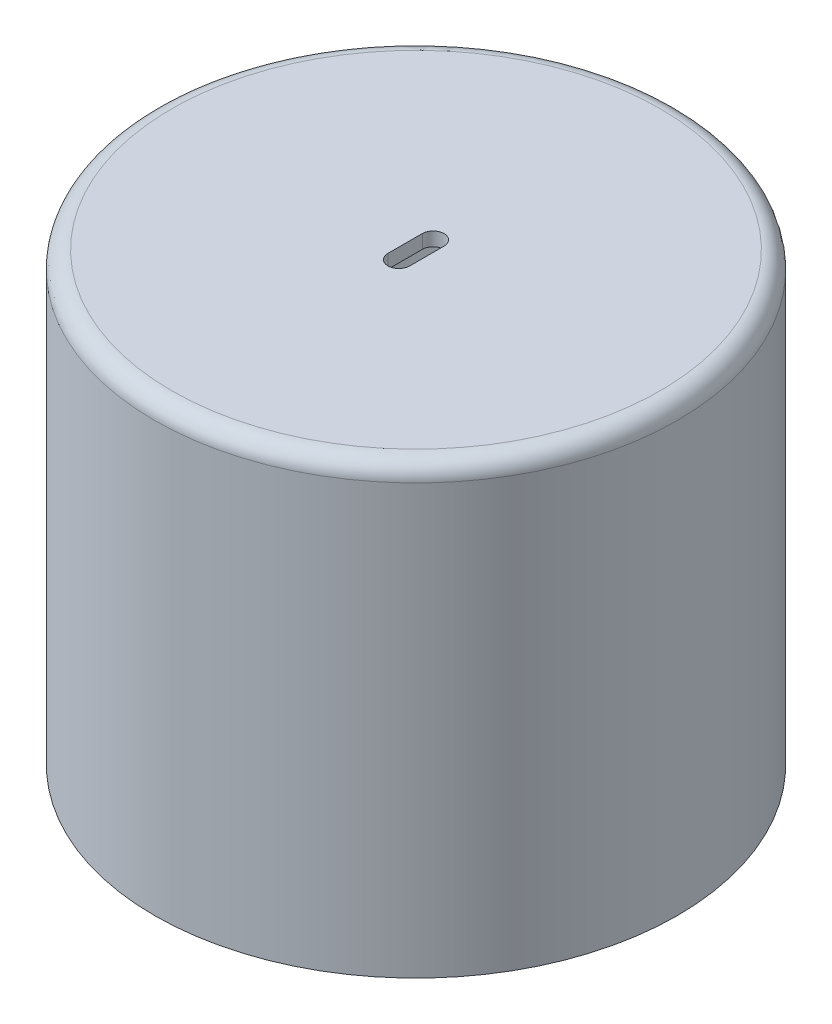
ISO-10303-21;
HEADER;
FILE_DESCRIPTION(('STEP AP214'),'2;1');
FILE_NAME('part.step','',(''),(''),'','','');
FILE_SCHEMA(('AUTOMOTIVE_DESIGN { 1 0 10303 214 1 1 1 1 }'));
ENDSEC;
DATA;
#1=APPLICATION_CONTEXT('core data for automotive mechanical design processes');
#2=APPLICATION_PROTOCOL_DEFINITION('international standard','automotive_design',2000,#1);
#3=PRODUCT_CONTEXT('',#1,'mechanical');
#4=PRODUCT('Part','Part','',(#3));
#5=PRODUCT_RELATED_PRODUCT_CATEGORY('part','',(#4));
#6=PRODUCT_DEFINITION_FORMATION('','',#4);
#7=PRODUCT_DEFINITION_CONTEXT('part definition',#1,'design');
#8=PRODUCT_DEFINITION('design','',#6,#7);
#9=PRODUCT_DEFINITION_SHAPE('','',#8);
#10=(LENGTH_UNIT() NAMED_UNIT(*) SI_UNIT(.MILLI.,.METRE.));
#11=(NAMED_UNIT(*) PLANE_ANGLE_UNIT() SI_UNIT($,.RADIAN.));
#12=(NAMED_UNIT(*) SI_UNIT($,.STERADIAN.) SOLID_ANGLE_UNIT());
#13=UNCERTAINTY_MEASURE_WITH_UNIT(LENGTH_MEASURE(1.E-05),#10,'distance_accuracy_value','');
#14=(GEOMETRIC_REPRESENTATION_CONTEXT(3) GLOBAL_UNCERTAINTY_ASSIGNED_CONTEXT((#13)) GLOBAL_UNIT_ASSIGNED_CONTEXT((#10,
#11,#12)) REPRESENTATION_CONTEXT('',''));
#15=CARTESIAN_POINT('',(0.,0.,0.));
#16=DIRECTION('',(0.,0.,1.));
#17=DIRECTION('',(1.,0.,0.));
#18=AXIS2_PLACEMENT_3D('',#15,#16,#17);
#19=CARTESIAN_POINT('',(0.,130.,0.));
#20=DIRECTION('',(0.,1.,0.));
#21=DIRECTION('',(0.,0.,1.));
#22=AXIS2_PLACEMENT_3D('',#19,#20,#21);
#23=PLANE('',#22);
#24=CARTESIAN_POINT('',(0.,130.,0.));
#25=DIRECTION('',(0.,1.,0.));
#26=DIRECTION('',(0.,0.,1.));
#27=AXIS2_PLACEMENT_3D('',#24,#25,#26);
#28=CIRCLE('',#27,71.2);
#29=CARTESIAN_POINT('',(0.,130.,71.2));
#30=VERTEX_POINT('',#29);
#31=EDGE_CURVE('E64',#30,#30,#28,.T.);
#32=ORIENTED_EDGE('',*,*,#31,.T.);
#33=EDGE_LOOP('',(#32));
#34=FACE_BOUND('',#33,.T.);
#35=DIRECTION('',(0.,0.,-1.));
#36=VECTOR('',#35,1.);
#37=CARTESIAN_POINT('',(3.175,130.,5.));
#38=LINE('',#37,#36);
#39=CARTESIAN_POINT('',(3.175,130.,5.));
#40=VERTEX_POINT('',#39);
#41=CARTESIAN_POINT('',(3.175,130.,-5.));
#42=VERTEX_POINT('',#41);
#43=EDGE_CURVE('E186',#40,#42,#38,.T.);
#44=ORIENTED_EDGE('',*,*,#43,.F.);
#45=CARTESIAN_POINT('',(0.,130.,5.));
#46=DIRECTION('',(0.,1.,0.));
#47=DIRECTION('',(0.,0.,1.));
#48=AXIS2_PLACEMENT_3D('',#45,#46,#47);
#49=CIRCLE('',#48,3.175);
#50=CARTESIAN_POINT('',(-3.175,130.,5.));
#51=VERTEX_POINT('',#50);
#52=EDGE_CURVE('E184',#51,#40,#49,.T.);
#53=ORIENTED_EDGE('',*,*,#52,.F.);
#54=DIRECTION('',(0.,0.,-1.));
#55=VECTOR('',#54,1.);
#56=CARTESIAN_POINT('',(-3.175,130.,5.));
#57=LINE('',#56,#55);
#58=CARTESIAN_POINT('',(-3.175,130.,-5.));
#59=VERTEX_POINT('',#58);
#60=EDGE_CURVE('E115',#51,#59,#57,.T.);
#61=ORIENTED_EDGE('',*,*,#60,.T.);
#62=CARTESIAN_POINT('',(0.,130.,-5.));
#63=DIRECTION('',(0.,1.,0.));
#64=DIRECTION('',(0.,0.,1.));
#65=AXIS2_PLACEMENT_3D('',#62,#63,#64);
#66=CIRCLE('',#65,3.175);
#67=EDGE_CURVE('E120',#42,#59,#66,.T.);
#68=ORIENTED_EDGE('',*,*,#67,.F.);
#69=EDGE_LOOP('',(#44,#53,#61,#68));
#70=FACE_BOUND('',#69,.T.);
#71=ADVANCED_FACE('F56',(#34,#70),#23,.T.);
#72=CARTESIAN_POINT('',(0.,0.,0.));
#73=DIRECTION('',(0.,1.,0.));
#74=DIRECTION('',(0.,0.,1.));
#75=AXIS2_PLACEMENT_3D('',#72,#73,#74);
#76=PLANE('',#75);
#77=CARTESIAN_POINT('',(0.,0.,0.));
#78=DIRECTION('',(0.,1.,0.));
#79=DIRECTION('',(0.,0.,1.));
#80=AXIS2_PLACEMENT_3D('',#77,#78,#79);
#81=CIRCLE('',#80,72.2);
#82=CARTESIAN_POINT('',(0.,0.,72.2));
#83=VERTEX_POINT('',#82);
#84=EDGE_CURVE('E103',#83,#83,#81,.T.);
#85=ORIENTED_EDGE('',*,*,#84,.T.);
#86=EDGE_LOOP('',(#85));
#87=FACE_BOUND('',#86,.T.);
#88=CARTESIAN_POINT('',(0.,0.,0.));
#89=DIRECTION('',(0.,1.,0.));
#90=DIRECTION('',(0.,0.,1.));
#91=AXIS2_PLACEMENT_3D('',#88,#89,#90);
#92=CIRCLE('',#91,76.2);
#93=CARTESIAN_POINT('',(0.,0.,76.2));
#94=VERTEX_POINT('',#93);
#95=EDGE_CURVE('E127',#94,#94,#92,.T.);
#96=ORIENTED_EDGE('',*,*,#95,.F.);
#97=EDGE_LOOP('',(#96));
#98=FACE_BOUND('',#97,.T.);
#99=ADVANCED_FACE('F144',(#87,#98),#76,.F.);
#100=CARTESIAN_POINT('',(0.,130.,0.));
#101=DIRECTION('',(0.,-1.,0.));
#102=DIRECTION('',(0.,0.,-1.));
#103=AXIS2_PLACEMENT_3D('',#100,#101,#102);
#104=CYLINDRICAL_SURFACE('',#103,76.2);
#105=CARTESIAN_POINT('',(0.,125.,0.));
#106=DIRECTION('',(0.,1.,0.));
#107=DIRECTION('',(0.,0.,1.));
#108=AXIS2_PLACEMENT_3D('',#105,#106,#107);
#109=CIRCLE('',#108,76.2);
#110=CARTESIAN_POINT('',(0.,125.,76.2));
#111=VERTEX_POINT('',#110);
#112=EDGE_CURVE('E13',#111,#111,#109,.F.);
#113=ORIENTED_EDGE('',*,*,#112,.T.);
#114=EDGE_LOOP('',(#113));
#115=FACE_BOUND('',#114,.T.);
#116=ORIENTED_EDGE('',*,*,#95,.T.);
#117=EDGE_LOOP('',(#116));
#118=FACE_BOUND('',#117,.T.);
#119=ADVANCED_FACE('F149',(#115,#118),#104,.T.);
#120=CARTESIAN_POINT('',(0.,130.,5.));
#121=DIRECTION('',(0.,-1.,0.));
#122=DIRECTION('',(0.,0.,-1.));
#123=AXIS2_PLACEMENT_3D('',#120,#121,#122);
#124=CYLINDRICAL_SURFACE('',#123,3.175);
#125=CARTESIAN_POINT('',(0.,126.,5.));
#126=DIRECTION('',(0.,1.,0.));
#127=DIRECTION('',(0.,0.,1.));
#128=AXIS2_PLACEMENT_3D('',#125,#126,#127);
#129=CIRCLE('',#128,3.175);
#130=CARTESIAN_POINT('',(-3.175,126.,5.));
#131=VERTEX_POINT('',#130);
#132=CARTESIAN_POINT('',(3.175,126.,5.));
#133=VERTEX_POINT('',#132);
#134=EDGE_CURVE('E99',#131,#133,#129,.T.);
#135=ORIENTED_EDGE('',*,*,#134,.F.);
#136=DIRECTION('',(0.,-1.,0.));
#137=VECTOR('',#136,1.);
#138=CARTESIAN_POINT('',(-3.175,130.,5.));
#139=LINE('',#138,#137);
#140=EDGE_CURVE('E108',#51,#131,#139,.T.);
#141=ORIENTED_EDGE('',*,*,#140,.F.);
#142=ORIENTED_EDGE('',*,*,#52,.T.);
#143=DIRECTION('',(0.,-1.,0.));
#144=VECTOR('',#143,1.);
#145=CARTESIAN_POINT('',(3.175,130.,5.));
#146=LINE('',#145,#144);
#147=EDGE_CURVE('E110',#40,#133,#146,.T.);
#148=ORIENTED_EDGE('',*,*,#147,.T.);
#149=EDGE_LOOP('',(#135,#141,#142,#148));
#150=FACE_BOUND('',#149,.T.);
#151=ADVANCED_FACE('F107',(#150),#124,.F.);
#152=CARTESIAN_POINT('',(3.175,130.,5.));
#153=DIRECTION('',(-1.,0.,0.));
#154=DIRECTION('',(0.,0.,1.));
#155=AXIS2_PLACEMENT_3D('',#152,#153,#154);
#156=PLANE('',#155);
#157=DIRECTION('',(0.,0.,-1.));
#158=VECTOR('',#157,1.);
#159=CARTESIAN_POINT('',(3.175,126.,0.));
#160=LINE('',#159,#158);
#161=CARTESIAN_POINT('',(3.175,126.,-5.));
#162=VERTEX_POINT('',#161);
#163=EDGE_CURVE('E111',#133,#162,#160,.T.);
#164=ORIENTED_EDGE('',*,*,#163,.F.);
#165=ORIENTED_EDGE('',*,*,#147,.F.);
#166=ORIENTED_EDGE('',*,*,#43,.T.);
#167=DIRECTION('',(0.,-1.,0.));
#168=VECTOR('',#167,1.);
#169=CARTESIAN_POINT('',(3.175,130.,-5.));
#170=LINE('',#169,#168);
#171=EDGE_CURVE('E118',#42,#162,#170,.T.);
#172=ORIENTED_EDGE('',*,*,#171,.T.);
#173=EDGE_LOOP('',(#164,#165,#166,#172));
#174=FACE_BOUND('',#173,.T.);
#175=ADVANCED_FACE('F158',(#174),#156,.T.);
#176=CARTESIAN_POINT('',(0.,130.,-5.));
#177=DIRECTION('',(0.,-1.,0.));
#178=DIRECTION('',(0.,0.,-1.));
#179=AXIS2_PLACEMENT_3D('',#176,#177,#178);
#180=CYLINDRICAL_SURFACE('',#179,3.175);
#181=CARTESIAN_POINT('',(0.,126.,-5.));
#182=DIRECTION('',(0.,1.,0.));
#183=DIRECTION('',(0.,0.,1.));
#184=AXIS2_PLACEMENT_3D('',#181,#182,#183);
#185=CIRCLE('',#184,3.175);
#186=CARTESIAN_POINT('',(-3.175,126.,-5.));
#187=VERTEX_POINT('',#186);
#188=EDGE_CURVE('E71',#162,#187,#185,.T.);
#189=ORIENTED_EDGE('',*,*,#188,.F.);
#190=ORIENTED_EDGE('',*,*,#171,.F.);
#191=ORIENTED_EDGE('',*,*,#67,.T.);
#192=DIRECTION('',(0.,-1.,0.));
#193=VECTOR('',#192,1.);
#194=CARTESIAN_POINT('',(-3.175,130.,-5.));
#195=LINE('',#194,#193);
#196=EDGE_CURVE('E78',#59,#187,#195,.T.);
#197=ORIENTED_EDGE('',*,*,#196,.T.);
#198=EDGE_LOOP('',(#189,#190,#191,#197));
#199=FACE_BOUND('',#198,.T.);
#200=ADVANCED_FACE('F165',(#199),#180,.F.);
#201=CARTESIAN_POINT('',(-3.175,130.,5.));
#202=DIRECTION('',(-1.,0.,0.));
#203=DIRECTION('',(0.,0.,1.));
#204=AXIS2_PLACEMENT_3D('',#201,#202,#203);
#205=PLANE('',#204);
#206=ORIENTED_EDGE('',*,*,#140,.T.);
#207=DIRECTION('',(0.,0.,-1.));
#208=VECTOR('',#207,1.);
#209=CARTESIAN_POINT('',(-3.175,126.,0.));
#210=LINE('',#209,#208);
#211=EDGE_CURVE('E95',#131,#187,#210,.T.);
#212=ORIENTED_EDGE('',*,*,#211,.T.);
#213=ORIENTED_EDGE('',*,*,#196,.F.);
#214=ORIENTED_EDGE('',*,*,#60,.F.);
#215=EDGE_LOOP('',(#206,#212,#213,#214));
#216=FACE_BOUND('',#215,.T.);
#217=ADVANCED_FACE('F113',(#216),#205,.F.);
#218=CARTESIAN_POINT('',(0.,334.212438406675,0.));
#219=DIRECTION('',(0.,-1.,0.));
#220=DIRECTION('',(0.,0.,-1.));
#221=AXIS2_PLACEMENT_3D('',#218,#219,#220);
#222=CYLINDRICAL_SURFACE('',#221,72.2);
#223=ORIENTED_EDGE('',*,*,#84,.F.);
#224=EDGE_LOOP('',(#223));
#225=FACE_BOUND('',#224,.T.);
#226=CARTESIAN_POINT('',(0.,126.,0.));
#227=DIRECTION('',(0.,1.,0.));
#228=DIRECTION('',(0.,0.,1.));
#229=AXIS2_PLACEMENT_3D('',#226,#227,#228);
#230=CIRCLE('',#229,72.2);
#231=CARTESIAN_POINT('',(0.,126.,72.2));
#232=VERTEX_POINT('',#231);
#233=EDGE_CURVE('E102',#232,#232,#230,.T.);
#234=ORIENTED_EDGE('',*,*,#233,.T.);
#235=EDGE_LOOP('',(#234));
#236=FACE_BOUND('',#235,.T.);
#237=ADVANCED_FACE('F140',(#225,#236),#222,.F.);
#238=CARTESIAN_POINT('',(0.,126.,0.));
#239=DIRECTION('',(0.,1.,0.));
#240=DIRECTION('',(0.,0.,1.));
#241=AXIS2_PLACEMENT_3D('',#238,#239,#240);
#242=PLANE('',#241);
#243=ORIENTED_EDGE('',*,*,#188,.T.);
#244=ORIENTED_EDGE('',*,*,#211,.F.);
#245=ORIENTED_EDGE('',*,*,#134,.T.);
#246=ORIENTED_EDGE('',*,*,#163,.T.);
#247=EDGE_LOOP('',(#243,#244,#245,#246));
#248=FACE_BOUND('',#247,.T.);
#249=ORIENTED_EDGE('',*,*,#233,.F.);
#250=EDGE_LOOP('',(#249));
#251=FACE_BOUND('',#250,.T.);
#252=ADVANCED_FACE('F97',(#248,#251),#242,.F.);
#253=CARTESIAN_POINT('',(0.,125.,0.));
#254=DIRECTION('',(0.,1.,0.));
#255=DIRECTION('',(0.,0.,1.));
#256=AXIS2_PLACEMENT_3D('',#253,#254,#255);
#257=TOROIDAL_SURFACE('',#256,71.2,5.);
#258=ORIENTED_EDGE('',*,*,#112,.F.);
#259=EDGE_LOOP('',(#258));
#260=FACE_BOUND('',#259,.T.);
#261=ORIENTED_EDGE('',*,*,#31,.F.);
#262=EDGE_LOOP('',(#261));
#263=FACE_BOUND('',#262,.T.);
#264=ADVANCED_FACE('F58',(#260,#263),#257,.T.);
#265=CLOSED_SHELL('',(#71,#99,#119,#151,#175,#200,#217,#237,#252,#264));
#266=MANIFOLD_SOLID_BREP('B2',#265);
#267=ADVANCED_BREP_SHAPE_REPRESENTATION('',(#18,#266),#14);
#268=SHAPE_DEFINITION_REPRESENTATION(#9,#267);
ENDSEC;
END-ISO-10303-21;
